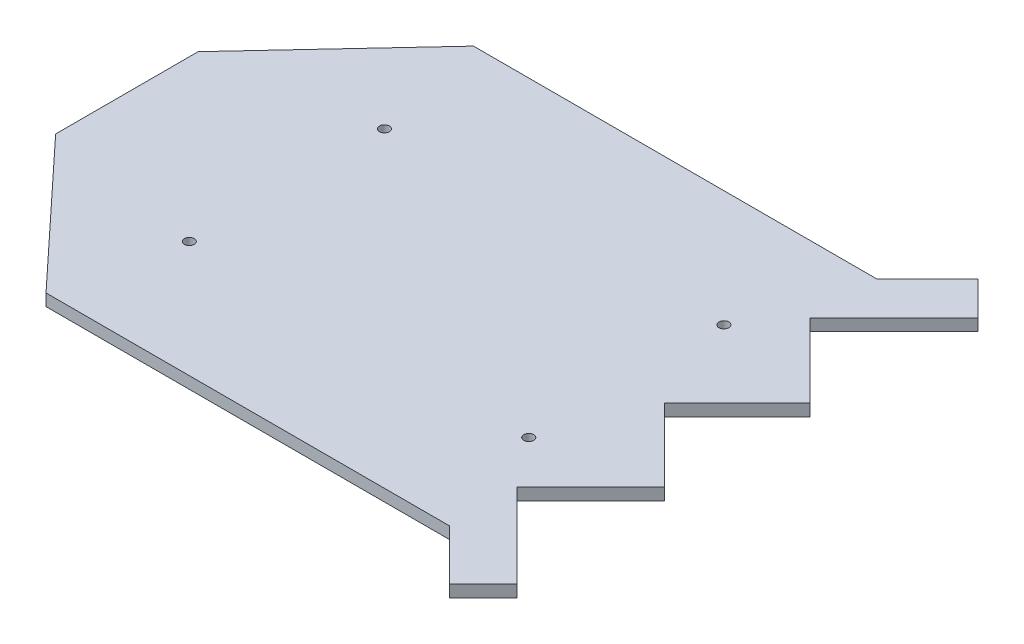
ISO-10303-21;
HEADER;
FILE_DESCRIPTION(('STEP AP214'),'2;1');
FILE_NAME('part.step','',(''),(''),'','','');
FILE_SCHEMA(('AUTOMOTIVE_DESIGN { 1 0 10303 214 1 1 1 1 }'));
ENDSEC;
DATA;
#1=APPLICATION_CONTEXT('core data for automotive mechanical design processes');
#2=APPLICATION_PROTOCOL_DEFINITION('international standard','automotive_design',2000,#1);
#3=PRODUCT_CONTEXT('',#1,'mechanical');
#4=PRODUCT('Part','Part','',(#3));
#5=PRODUCT_RELATED_PRODUCT_CATEGORY('part','',(#4));
#6=PRODUCT_DEFINITION_FORMATION('','',#4);
#7=PRODUCT_DEFINITION_CONTEXT('part definition',#1,'design');
#8=PRODUCT_DEFINITION('design','',#6,#7);
#9=PRODUCT_DEFINITION_SHAPE('','',#8);
#10=(LENGTH_UNIT() NAMED_UNIT(*) SI_UNIT(.MILLI.,.METRE.));
#11=(NAMED_UNIT(*) PLANE_ANGLE_UNIT() SI_UNIT($,.RADIAN.));
#12=(NAMED_UNIT(*) SI_UNIT($,.STERADIAN.) SOLID_ANGLE_UNIT());
#13=UNCERTAINTY_MEASURE_WITH_UNIT(LENGTH_MEASURE(1.E-05),#10,'distance_accuracy_value','');
#14=(GEOMETRIC_REPRESENTATION_CONTEXT(3) GLOBAL_UNCERTAINTY_ASSIGNED_CONTEXT((#13)) GLOBAL_UNIT_ASSIGNED_CONTEXT((#10,
#11,#12)) REPRESENTATION_CONTEXT('',''));
#15=CARTESIAN_POINT('',(0.,0.,0.));
#16=DIRECTION('',(0.,0.,1.));
#17=DIRECTION('',(1.,0.,0.));
#18=AXIS2_PLACEMENT_3D('',#15,#16,#17);
#19=CARTESIAN_POINT('',(0.,5.,0.));
#20=DIRECTION('',(0.,1.,0.));
#21=DIRECTION('',(0.,0.,1.));
#22=AXIS2_PLACEMENT_3D('',#19,#20,#21);
#23=PLANE('',#22);
#24=CARTESIAN_POINT('',(67.3700000000001,5.,-41.08));
#25=DIRECTION('',(0.,1.,0.));
#26=DIRECTION('',(0.,0.,1.));
#27=AXIS2_PLACEMENT_3D('',#24,#25,#26);
#28=CIRCLE('',#27,2.09999999999999);
#29=CARTESIAN_POINT('',(67.3700000000001,5.,-38.98));
#30=VERTEX_POINT('',#29);
#31=EDGE_CURVE('E281',#30,#30,#28,.T.);
#32=ORIENTED_EDGE('',*,*,#31,.F.);
#33=EDGE_LOOP('',(#32));
#34=FACE_BOUND('',#33,.T.);
#35=CARTESIAN_POINT('',(67.3600000000001,5.,41.08));
#36=DIRECTION('',(0.,1.,0.));
#37=DIRECTION('',(0.,0.,1.));
#38=AXIS2_PLACEMENT_3D('',#35,#36,#37);
#39=CIRCLE('',#38,2.09999999999999);
#40=CARTESIAN_POINT('',(67.3600000000001,5.,43.18));
#41=VERTEX_POINT('',#40);
#42=EDGE_CURVE('E289',#41,#41,#39,.T.);
#43=ORIENTED_EDGE('',*,*,#42,.F.);
#44=EDGE_LOOP('',(#43));
#45=FACE_BOUND('',#44,.T.);
#46=CARTESIAN_POINT('',(210.29,5.,41.08));
#47=DIRECTION('',(0.,-1.,0.));
#48=DIRECTION('',(0.,0.,-1.));
#49=AXIS2_PLACEMENT_3D('',#46,#47,#48);
#50=CIRCLE('',#49,2.09999999999999);
#51=CARTESIAN_POINT('',(210.29,5.,38.98));
#52=VERTEX_POINT('',#51);
#53=EDGE_CURVE('E304',#52,#52,#50,.T.);
#54=ORIENTED_EDGE('',*,*,#53,.T.);
#55=EDGE_LOOP('',(#54));
#56=FACE_BOUND('',#55,.T.);
#57=DIRECTION('',(0.,0.,-1.));
#58=VECTOR('',#57,1.);
#59=CARTESIAN_POINT('',(0.,5.,0.));
#60=LINE('',#59,#58);
#61=CARTESIAN_POINT('',(0.,5.,30.));
#62=VERTEX_POINT('',#61);
#63=CARTESIAN_POINT('',(0.,5.,-30.));
#64=VERTEX_POINT('',#63);
#65=EDGE_CURVE('E237',#62,#64,#60,.T.);
#66=ORIENTED_EDGE('',*,*,#65,.F.);
#67=DIRECTION('',(0.681927251390247,0.,0.731420005066407));
#68=VECTOR('',#67,1.);
#69=CARTESIAN_POINT('',(-14.9632570100033,5.,13.9507432856597));
#70=LINE('',#69,#68);
#71=CARTESIAN_POINT('',(55.94,5.,90.));
#72=VERTEX_POINT('',#71);
#73=EDGE_CURVE('E313',#62,#72,#70,.T.);
#74=ORIENTED_EDGE('',*,*,#73,.T.);
#75=DIRECTION('',(1.,0.,0.));
#76=VECTOR('',#75,1.);
#77=CARTESIAN_POINT('',(0.,5.,90.));
#78=LINE('',#77,#76);
#79=CARTESIAN_POINT('',(225.94,5.,90.));
#80=VERTEX_POINT('',#79);
#81=EDGE_CURVE('E316',#72,#80,#78,.T.);
#82=ORIENTED_EDGE('',*,*,#81,.T.);
#83=DIRECTION('',(0.707106781186548,0.,0.707106781186547));
#84=VECTOR('',#83,1.);
#85=CARTESIAN_POINT('',(67.9699999999999,5.,-67.97));
#86=LINE('',#85,#84);
#87=CARTESIAN_POINT('',(247.153203435596,5.,111.213203435596));
#88=VERTEX_POINT('',#87);
#89=EDGE_CURVE('E319',#80,#88,#86,.T.);
#90=ORIENTED_EDGE('',*,*,#89,.T.);
#91=DIRECTION('',(0.707106781186546,0.,-0.707106781186549));
#92=VECTOR('',#91,1.);
#93=CARTESIAN_POINT('',(179.183203435597,5.,179.183203435596));
#94=LINE('',#93,#92);
#95=CARTESIAN_POINT('',(261.295339059327,5.,97.0710678118653));
#96=VERTEX_POINT('',#95);
#97=EDGE_CURVE('E322',#88,#96,#94,.T.);
#98=ORIENTED_EDGE('',*,*,#97,.T.);
#99=DIRECTION('',(-0.707106781186549,0.,-0.707106781186547));
#100=VECTOR('',#99,1.);
#101=CARTESIAN_POINT('',(82.1121356237306,5.,-82.1121356237309));
#102=LINE('',#101,#100);
#103=CARTESIAN_POINT('',(225.94,5.,61.7157287525381));
#104=VERTEX_POINT('',#103);
#105=EDGE_CURVE('E325',#96,#104,#102,.T.);
#106=ORIENTED_EDGE('',*,*,#105,.T.);
#107=DIRECTION('',(0.707106781186546,0.,-0.707106781186549));
#108=VECTOR('',#107,1.);
#109=CARTESIAN_POINT('',(143.82786437627,5.,143.827864376269));
#110=LINE('',#109,#108);
#111=CARTESIAN_POINT('',(256.965728752538,5.,30.69));
#112=VERTEX_POINT('',#111);
#113=EDGE_CURVE('E328',#104,#112,#110,.T.);
#114=ORIENTED_EDGE('',*,*,#113,.T.);
#115=DIRECTION('',(-0.706575466921842,0.,-0.707637696525688));
#116=VECTOR('',#115,1.);
#117=CARTESIAN_POINT('',(113.330891101913,5.,-113.160770956887));
#118=LINE('',#117,#116);
#119=CARTESIAN_POINT('',(226.32179727984,5.,0.));
#120=VERTEX_POINT('',#119);
#121=EDGE_CURVE('E331',#112,#120,#118,.T.);
#122=ORIENTED_EDGE('',*,*,#121,.T.);
#123=DIRECTION('',(-0.706575466921842,0.,0.707637696525688));
#124=VECTOR('',#123,1.);
#125=CARTESIAN_POINT('',(113.330891101913,5.,113.160770956887));
#126=LINE('',#125,#124);
#127=CARTESIAN_POINT('',(256.965728752538,5.,-30.6900000000001));
#128=VERTEX_POINT('',#127);
#129=EDGE_CURVE('E334',#128,#120,#126,.T.);
#130=ORIENTED_EDGE('',*,*,#129,.F.);
#131=DIRECTION('',(0.707106781186547,0.,0.707106781186548));
#132=VECTOR('',#131,1.);
#133=CARTESIAN_POINT('',(143.827864376269,5.,-143.827864376269));
#134=LINE('',#133,#132);
#135=CARTESIAN_POINT('',(225.94,5.,-61.7157287525381));
#136=VERTEX_POINT('',#135);
#137=EDGE_CURVE('E338',#136,#128,#134,.T.);
#138=ORIENTED_EDGE('',*,*,#137,.F.);
#139=DIRECTION('',(-0.707106781186548,0.,0.707106781186547));
#140=VECTOR('',#139,1.);
#141=CARTESIAN_POINT('',(82.1121356237309,5.,82.112135623731));
#142=LINE('',#141,#140);
#143=CARTESIAN_POINT('',(261.295339059327,5.,-97.0710678118654));
#144=VERTEX_POINT('',#143);
#145=EDGE_CURVE('E342',#144,#136,#142,.T.);
#146=ORIENTED_EDGE('',*,*,#145,.F.);
#147=DIRECTION('',(0.707106781186546,0.,0.707106781186549));
#148=VECTOR('',#147,1.);
#149=CARTESIAN_POINT('',(179.183203435597,5.,-179.183203435596));
#150=LINE('',#149,#148);
#151=CARTESIAN_POINT('',(247.153203435596,5.,-111.213203435596));
#152=VERTEX_POINT('',#151);
#153=EDGE_CURVE('E175',#152,#144,#150,.T.);
#154=ORIENTED_EDGE('',*,*,#153,.F.);
#155=DIRECTION('',(0.707106781186548,0.,-0.707106781186547));
#156=VECTOR('',#155,1.);
#157=CARTESIAN_POINT('',(67.9699999999999,5.,67.97));
#158=LINE('',#157,#156);
#159=CARTESIAN_POINT('',(225.94,5.,-90.));
#160=VERTEX_POINT('',#159);
#161=EDGE_CURVE('E157',#160,#152,#158,.T.);
#162=ORIENTED_EDGE('',*,*,#161,.F.);
#163=DIRECTION('',(1.,0.,0.));
#164=VECTOR('',#163,1.);
#165=CARTESIAN_POINT('',(0.,5.,-90.));
#166=LINE('',#165,#164);
#167=CARTESIAN_POINT('',(55.94,5.,-90.));
#168=VERTEX_POINT('',#167);
#169=EDGE_CURVE('E172',#168,#160,#166,.T.);
#170=ORIENTED_EDGE('',*,*,#169,.F.);
#171=DIRECTION('',(0.681927251390247,0.,-0.731420005066407));
#172=VECTOR('',#171,1.);
#173=CARTESIAN_POINT('',(-14.9632570100033,5.,-13.9507432856597));
#174=LINE('',#173,#172);
#175=EDGE_CURVE('E180',#64,#168,#174,.T.);
#176=ORIENTED_EDGE('',*,*,#175,.F.);
#177=EDGE_LOOP('',(#66,#74,#82,#90,#98,#106,#114,#122,#130,#138,#146,#154,#162,#170,#176));
#178=FACE_BOUND('',#177,.T.);
#179=CARTESIAN_POINT('',(210.29,5.,-41.08));
#180=DIRECTION('',(0.,1.,0.));
#181=DIRECTION('',(0.,0.,1.));
#182=AXIS2_PLACEMENT_3D('',#179,#180,#181);
#183=CIRCLE('',#182,2.09999999999999);
#184=CARTESIAN_POINT('',(210.29,5.,-38.98));
#185=VERTEX_POINT('',#184);
#186=EDGE_CURVE('E300',#185,#185,#183,.T.);
#187=ORIENTED_EDGE('',*,*,#186,.F.);
#188=EDGE_LOOP('',(#187));
#189=FACE_BOUND('',#188,.T.);
#190=ADVANCED_FACE('F42',(#34,#45,#56,#178,#189),#23,.T.);
#191=CARTESIAN_POINT('',(0.,0.,0.));
#192=DIRECTION('',(0.,1.,0.));
#193=DIRECTION('',(0.,0.,1.));
#194=AXIS2_PLACEMENT_3D('',#191,#192,#193);
#195=PLANE('',#194);
#196=CARTESIAN_POINT('',(67.3700000000001,0.,-41.08));
#197=DIRECTION('',(0.,1.,0.));
#198=DIRECTION('',(0.,0.,1.));
#199=AXIS2_PLACEMENT_3D('',#196,#197,#198);
#200=CIRCLE('',#199,2.09999999999999);
#201=CARTESIAN_POINT('',(67.3700000000001,0.,-38.98));
#202=VERTEX_POINT('',#201);
#203=EDGE_CURVE('E46',#202,#202,#200,.T.);
#204=ORIENTED_EDGE('',*,*,#203,.T.);
#205=EDGE_LOOP('',(#204));
#206=FACE_BOUND('',#205,.T.);
#207=CARTESIAN_POINT('',(67.3600000000001,0.,41.08));
#208=DIRECTION('',(0.,1.,0.));
#209=DIRECTION('',(0.,0.,1.));
#210=AXIS2_PLACEMENT_3D('',#207,#208,#209);
#211=CIRCLE('',#210,2.09999999999999);
#212=CARTESIAN_POINT('',(67.3600000000001,0.,43.18));
#213=VERTEX_POINT('',#212);
#214=EDGE_CURVE('E278',#213,#213,#211,.T.);
#215=ORIENTED_EDGE('',*,*,#214,.T.);
#216=EDGE_LOOP('',(#215));
#217=FACE_BOUND('',#216,.T.);
#218=DIRECTION('',(0.,0.,-1.));
#219=VECTOR('',#218,1.);
#220=CARTESIAN_POINT('',(0.,0.,0.));
#221=LINE('',#220,#219);
#222=CARTESIAN_POINT('',(0.,0.,30.));
#223=VERTEX_POINT('',#222);
#224=CARTESIAN_POINT('',(0.,0.,-30.));
#225=VERTEX_POINT('',#224);
#226=EDGE_CURVE('E186',#223,#225,#221,.T.);
#227=ORIENTED_EDGE('',*,*,#226,.T.);
#228=DIRECTION('',(0.681927251390247,0.,-0.731420005066407));
#229=VECTOR('',#228,1.);
#230=CARTESIAN_POINT('',(-14.9632570100033,0.,-13.9507432856597));
#231=LINE('',#230,#229);
#232=CARTESIAN_POINT('',(55.94,0.,-90.));
#233=VERTEX_POINT('',#232);
#234=EDGE_CURVE('E233',#225,#233,#231,.T.);
#235=ORIENTED_EDGE('',*,*,#234,.T.);
#236=DIRECTION('',(1.,0.,0.));
#237=VECTOR('',#236,1.);
#238=CARTESIAN_POINT('',(0.,0.,-90.));
#239=LINE('',#238,#237);
#240=CARTESIAN_POINT('',(225.94,0.,-90.));
#241=VERTEX_POINT('',#240);
#242=EDGE_CURVE('E230',#233,#241,#239,.T.);
#243=ORIENTED_EDGE('',*,*,#242,.T.);
#244=DIRECTION('',(0.707106781186548,0.,-0.707106781186547));
#245=VECTOR('',#244,1.);
#246=CARTESIAN_POINT('',(67.9699999999999,0.,67.97));
#247=LINE('',#246,#245);
#248=CARTESIAN_POINT('',(247.153203435596,0.,-111.213203435596));
#249=VERTEX_POINT('',#248);
#250=EDGE_CURVE('E159',#241,#249,#247,.T.);
#251=ORIENTED_EDGE('',*,*,#250,.T.);
#252=DIRECTION('',(0.707106781186546,0.,0.707106781186549));
#253=VECTOR('',#252,1.);
#254=CARTESIAN_POINT('',(179.183203435597,0.,-179.183203435596));
#255=LINE('',#254,#253);
#256=CARTESIAN_POINT('',(261.295339059327,0.,-97.0710678118654));
#257=VERTEX_POINT('',#256);
#258=EDGE_CURVE('E224',#249,#257,#255,.T.);
#259=ORIENTED_EDGE('',*,*,#258,.T.);
#260=DIRECTION('',(-0.707106781186548,0.,0.707106781186547));
#261=VECTOR('',#260,1.);
#262=CARTESIAN_POINT('',(82.1121356237309,0.,82.112135623731));
#263=LINE('',#262,#261);
#264=CARTESIAN_POINT('',(225.94,0.,-61.7157287525381));
#265=VERTEX_POINT('',#264);
#266=EDGE_CURVE('E220',#257,#265,#263,.T.);
#267=ORIENTED_EDGE('',*,*,#266,.T.);
#268=DIRECTION('',(0.707106781186547,0.,0.707106781186548));
#269=VECTOR('',#268,1.);
#270=CARTESIAN_POINT('',(143.827864376269,0.,-143.827864376269));
#271=LINE('',#270,#269);
#272=CARTESIAN_POINT('',(256.965728752538,0.,-30.6900000000001));
#273=VERTEX_POINT('',#272);
#274=EDGE_CURVE('E216',#265,#273,#271,.T.);
#275=ORIENTED_EDGE('',*,*,#274,.T.);
#276=DIRECTION('',(-0.706575466921842,0.,0.707637696525688));
#277=VECTOR('',#276,1.);
#278=CARTESIAN_POINT('',(113.330891101913,0.,113.160770956887));
#279=LINE('',#278,#277);
#280=CARTESIAN_POINT('',(226.32179727984,0.,0.));
#281=VERTEX_POINT('',#280);
#282=EDGE_CURVE('E212',#273,#281,#279,.T.);
#283=ORIENTED_EDGE('',*,*,#282,.T.);
#284=DIRECTION('',(-0.706575466921842,0.,-0.707637696525688));
#285=VECTOR('',#284,1.);
#286=CARTESIAN_POINT('',(113.330891101913,0.,-113.160770956887));
#287=LINE('',#286,#285);
#288=CARTESIAN_POINT('',(256.965728752538,0.,30.69));
#289=VERTEX_POINT('',#288);
#290=EDGE_CURVE('E208',#289,#281,#287,.T.);
#291=ORIENTED_EDGE('',*,*,#290,.F.);
#292=DIRECTION('',(0.707106781186546,0.,-0.707106781186549));
#293=VECTOR('',#292,1.);
#294=CARTESIAN_POINT('',(143.82786437627,0.,143.827864376269));
#295=LINE('',#294,#293);
#296=CARTESIAN_POINT('',(225.94,0.,61.7157287525381));
#297=VERTEX_POINT('',#296);
#298=EDGE_CURVE('E205',#297,#289,#295,.T.);
#299=ORIENTED_EDGE('',*,*,#298,.F.);
#300=DIRECTION('',(-0.707106781186549,0.,-0.707106781186547));
#301=VECTOR('',#300,1.);
#302=CARTESIAN_POINT('',(82.1121356237306,0.,-82.1121356237309));
#303=LINE('',#302,#301);
#304=CARTESIAN_POINT('',(261.295339059327,0.,97.0710678118653));
#305=VERTEX_POINT('',#304);
#306=EDGE_CURVE('E202',#305,#297,#303,.T.);
#307=ORIENTED_EDGE('',*,*,#306,.F.);
#308=DIRECTION('',(0.707106781186546,0.,-0.707106781186549));
#309=VECTOR('',#308,1.);
#310=CARTESIAN_POINT('',(179.183203435597,0.,179.183203435596));
#311=LINE('',#310,#309);
#312=CARTESIAN_POINT('',(247.153203435596,0.,111.213203435596));
#313=VERTEX_POINT('',#312);
#314=EDGE_CURVE('E199',#313,#305,#311,.T.);
#315=ORIENTED_EDGE('',*,*,#314,.F.);
#316=DIRECTION('',(0.707106781186548,0.,0.707106781186547));
#317=VECTOR('',#316,1.);
#318=CARTESIAN_POINT('',(67.9699999999999,0.,-67.97));
#319=LINE('',#318,#317);
#320=CARTESIAN_POINT('',(225.94,0.,90.));
#321=VERTEX_POINT('',#320);
#322=EDGE_CURVE('E196',#321,#313,#319,.T.);
#323=ORIENTED_EDGE('',*,*,#322,.F.);
#324=DIRECTION('',(1.,0.,0.));
#325=VECTOR('',#324,1.);
#326=CARTESIAN_POINT('',(0.,0.,90.));
#327=LINE('',#326,#325);
#328=CARTESIAN_POINT('',(55.94,0.,90.));
#329=VERTEX_POINT('',#328);
#330=EDGE_CURVE('E193',#329,#321,#327,.T.);
#331=ORIENTED_EDGE('',*,*,#330,.F.);
#332=DIRECTION('',(0.681927251390247,0.,0.731420005066407));
#333=VECTOR('',#332,1.);
#334=CARTESIAN_POINT('',(-14.9632570100033,0.,13.9507432856597));
#335=LINE('',#334,#333);
#336=EDGE_CURVE('E189',#223,#329,#335,.T.);
#337=ORIENTED_EDGE('',*,*,#336,.F.);
#338=EDGE_LOOP('',(#227,#235,#243,#251,#259,#267,#275,#283,#291,#299,#307,#315,#323,#331,#337));
#339=FACE_BOUND('',#338,.T.);
#340=CARTESIAN_POINT('',(210.29,0.,41.08));
#341=DIRECTION('',(0.,-1.,0.));
#342=DIRECTION('',(0.,0.,-1.));
#343=AXIS2_PLACEMENT_3D('',#340,#341,#342);
#344=CIRCLE('',#343,2.09999999999999);
#345=CARTESIAN_POINT('',(210.29,0.,38.98));
#346=VERTEX_POINT('',#345);
#347=EDGE_CURVE('E287',#346,#346,#344,.T.);
#348=ORIENTED_EDGE('',*,*,#347,.F.);
#349=EDGE_LOOP('',(#348));
#350=FACE_BOUND('',#349,.T.);
#351=CARTESIAN_POINT('',(210.29,0.,-41.08));
#352=DIRECTION('',(0.,1.,0.));
#353=DIRECTION('',(0.,0.,1.));
#354=AXIS2_PLACEMENT_3D('',#351,#352,#353);
#355=CIRCLE('',#354,2.09999999999999);
#356=CARTESIAN_POINT('',(210.29,0.,-38.98));
#357=VERTEX_POINT('',#356);
#358=EDGE_CURVE('E190',#357,#357,#355,.T.);
#359=ORIENTED_EDGE('',*,*,#358,.T.);
#360=EDGE_LOOP('',(#359));
#361=FACE_BOUND('',#360,.T.);
#362=ADVANCED_FACE('F351',(#206,#217,#339,#350,#361),#195,.F.);
#363=CARTESIAN_POINT('',(0.,5.,0.));
#364=DIRECTION('',(-1.,0.,0.));
#365=DIRECTION('',(0.,0.,1.));
#366=AXIS2_PLACEMENT_3D('',#363,#364,#365);
#367=PLANE('',#366);
#368=ORIENTED_EDGE('',*,*,#226,.F.);
#369=DIRECTION('',(0.,-1.,0.));
#370=VECTOR('',#369,1.);
#371=CARTESIAN_POINT('',(0.,5.,30.));
#372=LINE('',#371,#370);
#373=EDGE_CURVE('E11',#62,#223,#372,.T.);
#374=ORIENTED_EDGE('',*,*,#373,.F.);
#375=ORIENTED_EDGE('',*,*,#65,.T.);
#376=DIRECTION('',(0.,-1.,0.));
#377=VECTOR('',#376,1.);
#378=CARTESIAN_POINT('',(0.,5.,-30.));
#379=LINE('',#378,#377);
#380=EDGE_CURVE('E62',#64,#225,#379,.T.);
#381=ORIENTED_EDGE('',*,*,#380,.T.);
#382=EDGE_LOOP('',(#368,#374,#375,#381));
#383=FACE_BOUND('',#382,.T.);
#384=ADVANCED_FACE('F44',(#383),#367,.T.);
#385=CARTESIAN_POINT('',(-14.9632570100033,5.,13.9507432856597));
#386=DIRECTION('',(0.731420005066407,0.,-0.681927251390247));
#387=DIRECTION('',(-0.681927251390247,0.,-0.731420005066407));
#388=AXIS2_PLACEMENT_3D('',#385,#386,#387);
#389=PLANE('',#388);
#390=ORIENTED_EDGE('',*,*,#336,.T.);
#391=DIRECTION('',(0.,-1.,0.));
#392=VECTOR('',#391,1.);
#393=CARTESIAN_POINT('',(55.94,5.,90.));
#394=LINE('',#393,#392);
#395=EDGE_CURVE('E53',#72,#329,#394,.T.);
#396=ORIENTED_EDGE('',*,*,#395,.F.);
#397=ORIENTED_EDGE('',*,*,#73,.F.);
#398=ORIENTED_EDGE('',*,*,#373,.T.);
#399=EDGE_LOOP('',(#390,#396,#397,#398));
#400=FACE_BOUND('',#399,.T.);
#401=ADVANCED_FACE('F520',(#400),#389,.F.);
#402=CARTESIAN_POINT('',(0.,5.,90.));
#403=DIRECTION('',(0.,0.,-1.));
#404=DIRECTION('',(-1.,0.,0.));
#405=AXIS2_PLACEMENT_3D('',#402,#403,#404);
#406=PLANE('',#405);
#407=ORIENTED_EDGE('',*,*,#330,.T.);
#408=DIRECTION('',(0.,-1.,0.));
#409=VECTOR('',#408,1.);
#410=CARTESIAN_POINT('',(225.94,5.,90.));
#411=LINE('',#410,#409);
#412=EDGE_CURVE('E272',#80,#321,#411,.T.);
#413=ORIENTED_EDGE('',*,*,#412,.F.);
#414=ORIENTED_EDGE('',*,*,#81,.F.);
#415=ORIENTED_EDGE('',*,*,#395,.T.);
#416=EDGE_LOOP('',(#407,#413,#414,#415));
#417=FACE_BOUND('',#416,.T.);
#418=ADVANCED_FACE('F510',(#417),#406,.F.);
#419=CARTESIAN_POINT('',(67.9699999999999,5.,-67.97));
#420=DIRECTION('',(0.707106781186547,0.,-0.707106781186548));
#421=DIRECTION('',(-0.707106781186548,0.,-0.707106781186547));
#422=AXIS2_PLACEMENT_3D('',#419,#420,#421);
#423=PLANE('',#422);
#424=ORIENTED_EDGE('',*,*,#322,.T.);
#425=DIRECTION('',(0.,-1.,0.));
#426=VECTOR('',#425,1.);
#427=CARTESIAN_POINT('',(247.153203435596,5.,111.213203435596));
#428=LINE('',#427,#426);
#429=EDGE_CURVE('E268',#88,#313,#428,.T.);
#430=ORIENTED_EDGE('',*,*,#429,.F.);
#431=ORIENTED_EDGE('',*,*,#89,.F.);
#432=ORIENTED_EDGE('',*,*,#412,.T.);
#433=EDGE_LOOP('',(#424,#430,#431,#432));
#434=FACE_BOUND('',#433,.T.);
#435=ADVANCED_FACE('F500',(#434),#423,.F.);
#436=CARTESIAN_POINT('',(179.183203435597,5.,179.183203435596));
#437=DIRECTION('',(-0.707106781186549,0.,-0.707106781186546));
#438=DIRECTION('',(-0.707106781186546,0.,0.707106781186549));
#439=AXIS2_PLACEMENT_3D('',#436,#437,#438);
#440=PLANE('',#439);
#441=ORIENTED_EDGE('',*,*,#314,.T.);
#442=DIRECTION('',(0.,-1.,0.));
#443=VECTOR('',#442,1.);
#444=CARTESIAN_POINT('',(261.295339059327,5.,97.0710678118653));
#445=LINE('',#444,#443);
#446=EDGE_CURVE('E264',#96,#305,#445,.T.);
#447=ORIENTED_EDGE('',*,*,#446,.F.);
#448=ORIENTED_EDGE('',*,*,#97,.F.);
#449=ORIENTED_EDGE('',*,*,#429,.T.);
#450=EDGE_LOOP('',(#441,#447,#448,#449));
#451=FACE_BOUND('',#450,.T.);
#452=ADVANCED_FACE('F490',(#451),#440,.F.);
#453=CARTESIAN_POINT('',(82.1121356237306,5.,-82.1121356237309));
#454=DIRECTION('',(-0.707106781186547,0.,0.707106781186549));
#455=DIRECTION('',(0.707106781186549,0.,0.707106781186547));
#456=AXIS2_PLACEMENT_3D('',#453,#454,#455);
#457=PLANE('',#456);
#458=ORIENTED_EDGE('',*,*,#306,.T.);
#459=DIRECTION('',(0.,-1.,0.));
#460=VECTOR('',#459,1.);
#461=CARTESIAN_POINT('',(225.94,5.,61.7157287525381));
#462=LINE('',#461,#460);
#463=EDGE_CURVE('E260',#104,#297,#462,.T.);
#464=ORIENTED_EDGE('',*,*,#463,.F.);
#465=ORIENTED_EDGE('',*,*,#105,.F.);
#466=ORIENTED_EDGE('',*,*,#446,.T.);
#467=EDGE_LOOP('',(#458,#464,#465,#466));
#468=FACE_BOUND('',#467,.T.);
#469=ADVANCED_FACE('F480',(#468),#457,.F.);
#470=CARTESIAN_POINT('',(143.82786437627,5.,143.827864376269));
#471=DIRECTION('',(-0.707106781186549,0.,-0.707106781186546));
#472=DIRECTION('',(-0.707106781186546,0.,0.707106781186549));
#473=AXIS2_PLACEMENT_3D('',#470,#471,#472);
#474=PLANE('',#473);
#475=ORIENTED_EDGE('',*,*,#298,.T.);
#476=DIRECTION('',(0.,-1.,0.));
#477=VECTOR('',#476,1.);
#478=CARTESIAN_POINT('',(256.965728752538,5.,30.69));
#479=LINE('',#478,#477);
#480=EDGE_CURVE('E256',#112,#289,#479,.T.);
#481=ORIENTED_EDGE('',*,*,#480,.F.);
#482=ORIENTED_EDGE('',*,*,#113,.F.);
#483=ORIENTED_EDGE('',*,*,#463,.T.);
#484=EDGE_LOOP('',(#475,#481,#482,#483));
#485=FACE_BOUND('',#484,.T.);
#486=ADVANCED_FACE('F470',(#485),#474,.F.);
#487=CARTESIAN_POINT('',(113.330891101913,5.,-113.160770956887));
#488=DIRECTION('',(-0.707637696525688,0.,0.706575466921842));
#489=DIRECTION('',(0.706575466921842,0.,0.707637696525688));
#490=AXIS2_PLACEMENT_3D('',#487,#488,#489);
#491=PLANE('',#490);
#492=ORIENTED_EDGE('',*,*,#290,.T.);
#493=DIRECTION('',(0.,-1.,0.));
#494=VECTOR('',#493,1.);
#495=CARTESIAN_POINT('',(226.32179727984,5.,0.));
#496=LINE('',#495,#494);
#497=EDGE_CURVE('E253',#120,#281,#496,.T.);
#498=ORIENTED_EDGE('',*,*,#497,.F.);
#499=ORIENTED_EDGE('',*,*,#121,.F.);
#500=ORIENTED_EDGE('',*,*,#480,.T.);
#501=EDGE_LOOP('',(#492,#498,#499,#500));
#502=FACE_BOUND('',#501,.T.);
#503=ADVANCED_FACE('F460',(#502),#491,.F.);
#504=CARTESIAN_POINT('',(113.330891101913,5.,113.160770956887));
#505=DIRECTION('',(0.707637696525688,0.,0.706575466921842));
#506=DIRECTION('',(0.706575466921842,0.,-0.707637696525688));
#507=AXIS2_PLACEMENT_3D('',#504,#505,#506);
#508=PLANE('',#507);
#509=ORIENTED_EDGE('',*,*,#282,.F.);
#510=DIRECTION('',(0.,-1.,0.));
#511=VECTOR('',#510,1.);
#512=CARTESIAN_POINT('',(256.965728752538,5.,-30.6900000000001));
#513=LINE('',#512,#511);
#514=EDGE_CURVE('E250',#128,#273,#513,.T.);
#515=ORIENTED_EDGE('',*,*,#514,.F.);
#516=ORIENTED_EDGE('',*,*,#129,.T.);
#517=ORIENTED_EDGE('',*,*,#497,.T.);
#518=EDGE_LOOP('',(#509,#515,#516,#517));
#519=FACE_BOUND('',#518,.T.);
#520=ADVANCED_FACE('F450',(#519),#508,.T.);
#521=CARTESIAN_POINT('',(143.827864376269,5.,-143.827864376269));
#522=DIRECTION('',(0.707106781186548,0.,-0.707106781186547));
#523=DIRECTION('',(-0.707106781186547,0.,-0.707106781186548));
#524=AXIS2_PLACEMENT_3D('',#521,#522,#523);
#525=PLANE('',#524);
#526=ORIENTED_EDGE('',*,*,#274,.F.);
#527=DIRECTION('',(0.,-1.,0.));
#528=VECTOR('',#527,1.);
#529=CARTESIAN_POINT('',(225.94,5.,-61.7157287525381));
#530=LINE('',#529,#528);
#531=EDGE_CURVE('E247',#136,#265,#530,.T.);
#532=ORIENTED_EDGE('',*,*,#531,.F.);
#533=ORIENTED_EDGE('',*,*,#137,.T.);
#534=ORIENTED_EDGE('',*,*,#514,.T.);
#535=EDGE_LOOP('',(#526,#532,#533,#534));
#536=FACE_BOUND('',#535,.T.);
#537=ADVANCED_FACE('F440',(#536),#525,.T.);
#538=CARTESIAN_POINT('',(82.1121356237309,5.,82.112135623731));
#539=DIRECTION('',(0.707106781186547,0.,0.707106781186548));
#540=DIRECTION('',(0.707106781186548,0.,-0.707106781186547));
#541=AXIS2_PLACEMENT_3D('',#538,#539,#540);
#542=PLANE('',#541);
#543=ORIENTED_EDGE('',*,*,#266,.F.);
#544=DIRECTION('',(0.,-1.,0.));
#545=VECTOR('',#544,1.);
#546=CARTESIAN_POINT('',(261.295339059327,5.,-97.0710678118654));
#547=LINE('',#546,#545);
#548=EDGE_CURVE('E244',#144,#257,#547,.T.);
#549=ORIENTED_EDGE('',*,*,#548,.F.);
#550=ORIENTED_EDGE('',*,*,#145,.T.);
#551=ORIENTED_EDGE('',*,*,#531,.T.);
#552=EDGE_LOOP('',(#543,#549,#550,#551));
#553=FACE_BOUND('',#552,.T.);
#554=ADVANCED_FACE('F431',(#553),#542,.T.);
#555=CARTESIAN_POINT('',(179.183203435597,5.,-179.183203435596));
#556=DIRECTION('',(0.707106781186549,0.,-0.707106781186546));
#557=DIRECTION('',(-0.707106781186546,0.,-0.707106781186549));
#558=AXIS2_PLACEMENT_3D('',#555,#556,#557);
#559=PLANE('',#558);
#560=ORIENTED_EDGE('',*,*,#258,.F.);
#561=DIRECTION('',(0.,-1.,0.));
#562=VECTOR('',#561,1.);
#563=CARTESIAN_POINT('',(247.153203435596,5.,-111.213203435596));
#564=LINE('',#563,#562);
#565=EDGE_CURVE('E164',#152,#249,#564,.T.);
#566=ORIENTED_EDGE('',*,*,#565,.F.);
#567=ORIENTED_EDGE('',*,*,#153,.T.);
#568=ORIENTED_EDGE('',*,*,#548,.T.);
#569=EDGE_LOOP('',(#560,#566,#567,#568));
#570=FACE_BOUND('',#569,.T.);
#571=ADVANCED_FACE('F348',(#570),#559,.T.);
#572=CARTESIAN_POINT('',(67.9699999999999,5.,67.97));
#573=DIRECTION('',(-0.707106781186547,0.,-0.707106781186548));
#574=DIRECTION('',(-0.707106781186548,0.,0.707106781186547));
#575=AXIS2_PLACEMENT_3D('',#572,#573,#574);
#576=PLANE('',#575);
#577=ORIENTED_EDGE('',*,*,#250,.F.);
#578=DIRECTION('',(0.,-1.,0.));
#579=VECTOR('',#578,1.);
#580=CARTESIAN_POINT('',(225.94,5.,-90.));
#581=LINE('',#580,#579);
#582=EDGE_CURVE('E154',#160,#241,#581,.T.);
#583=ORIENTED_EDGE('',*,*,#582,.F.);
#584=ORIENTED_EDGE('',*,*,#161,.T.);
#585=ORIENTED_EDGE('',*,*,#565,.T.);
#586=EDGE_LOOP('',(#577,#583,#584,#585));
#587=FACE_BOUND('',#586,.T.);
#588=ADVANCED_FACE('F156',(#587),#576,.T.);
#589=CARTESIAN_POINT('',(0.,5.,-90.));
#590=DIRECTION('',(0.,0.,-1.));
#591=DIRECTION('',(-1.,0.,0.));
#592=AXIS2_PLACEMENT_3D('',#589,#590,#591);
#593=PLANE('',#592);
#594=ORIENTED_EDGE('',*,*,#242,.F.);
#595=DIRECTION('',(0.,-1.,0.));
#596=VECTOR('',#595,1.);
#597=CARTESIAN_POINT('',(55.94,5.,-90.));
#598=LINE('',#597,#596);
#599=EDGE_CURVE('E108',#168,#233,#598,.T.);
#600=ORIENTED_EDGE('',*,*,#599,.F.);
#601=ORIENTED_EDGE('',*,*,#169,.T.);
#602=ORIENTED_EDGE('',*,*,#582,.T.);
#603=EDGE_LOOP('',(#594,#600,#601,#602));
#604=FACE_BOUND('',#603,.T.);
#605=ADVANCED_FACE('F178',(#604),#593,.T.);
#606=CARTESIAN_POINT('',(-14.9632570100033,5.,-13.9507432856597));
#607=DIRECTION('',(-0.731420005066407,0.,-0.681927251390247));
#608=DIRECTION('',(-0.681927251390247,0.,0.731420005066407));
#609=AXIS2_PLACEMENT_3D('',#606,#607,#608);
#610=PLANE('',#609);
#611=ORIENTED_EDGE('',*,*,#234,.F.);
#612=ORIENTED_EDGE('',*,*,#380,.F.);
#613=ORIENTED_EDGE('',*,*,#175,.T.);
#614=ORIENTED_EDGE('',*,*,#599,.T.);
#615=EDGE_LOOP('',(#611,#612,#613,#614));
#616=FACE_BOUND('',#615,.T.);
#617=ADVANCED_FACE('F354',(#616),#610,.T.);
#618=CARTESIAN_POINT('',(210.29,0.,41.08));
#619=DIRECTION('',(0.,1.,0.));
#620=DIRECTION('',(0.,0.,1.));
#621=AXIS2_PLACEMENT_3D('',#618,#619,#620);
#622=CYLINDRICAL_SURFACE('',#621,2.09999999999999);
#623=ORIENTED_EDGE('',*,*,#347,.T.);
#624=EDGE_LOOP('',(#623));
#625=FACE_BOUND('',#624,.T.);
#626=ORIENTED_EDGE('',*,*,#53,.F.);
#627=EDGE_LOOP('',(#626));
#628=FACE_BOUND('',#627,.T.);
#629=ADVANCED_FACE('F356',(#625,#628),#622,.F.);
#630=CARTESIAN_POINT('',(210.29,0.,-41.08));
#631=DIRECTION('',(0.,1.,0.));
#632=DIRECTION('',(0.,0.,1.));
#633=AXIS2_PLACEMENT_3D('',#630,#631,#632);
#634=CYLINDRICAL_SURFACE('',#633,2.09999999999999);
#635=ORIENTED_EDGE('',*,*,#358,.F.);
#636=EDGE_LOOP('',(#635));
#637=FACE_BOUND('',#636,.T.);
#638=ORIENTED_EDGE('',*,*,#186,.T.);
#639=EDGE_LOOP('',(#638));
#640=FACE_BOUND('',#639,.T.);
#641=ADVANCED_FACE('F362',(#637,#640),#634,.F.);
#642=CARTESIAN_POINT('',(67.3600000000001,-5.,41.08));
#643=DIRECTION('',(0.,1.,0.));
#644=DIRECTION('',(0.,0.,1.));
#645=AXIS2_PLACEMENT_3D('',#642,#643,#644);
#646=CYLINDRICAL_SURFACE('',#645,2.09999999999999);
#647=ORIENTED_EDGE('',*,*,#42,.T.);
#648=EDGE_LOOP('',(#647));
#649=FACE_BOUND('',#648,.T.);
#650=ORIENTED_EDGE('',*,*,#214,.F.);
#651=EDGE_LOOP('',(#650));
#652=FACE_BOUND('',#651,.T.);
#653=ADVANCED_FACE('F378',(#649,#652),#646,.F.);
#654=CARTESIAN_POINT('',(67.3700000000001,-5.,-41.08));
#655=DIRECTION('',(0.,1.,0.));
#656=DIRECTION('',(0.,0.,1.));
#657=AXIS2_PLACEMENT_3D('',#654,#655,#656);
#658=CYLINDRICAL_SURFACE('',#657,2.09999999999999);
#659=ORIENTED_EDGE('',*,*,#31,.T.);
#660=EDGE_LOOP('',(#659));
#661=FACE_BOUND('',#660,.T.);
#662=ORIENTED_EDGE('',*,*,#203,.F.);
#663=EDGE_LOOP('',(#662));
#664=FACE_BOUND('',#663,.T.);
#665=ADVANCED_FACE('F382',(#661,#664),#658,.F.);
#666=CLOSED_SHELL('',(#190,#362,#384,#401,#418,#435,#452,#469,#486,#503,#520,#537,#554,#571,
#588,#605,#617,#629,#641,#653,#665));
#667=MANIFOLD_SOLID_BREP('B2',#666);
#668=ADVANCED_BREP_SHAPE_REPRESENTATION('',(#18,#667),#14);
#669=SHAPE_DEFINITION_REPRESENTATION(#9,#668);
ENDSEC;
END-ISO-10303-21;
